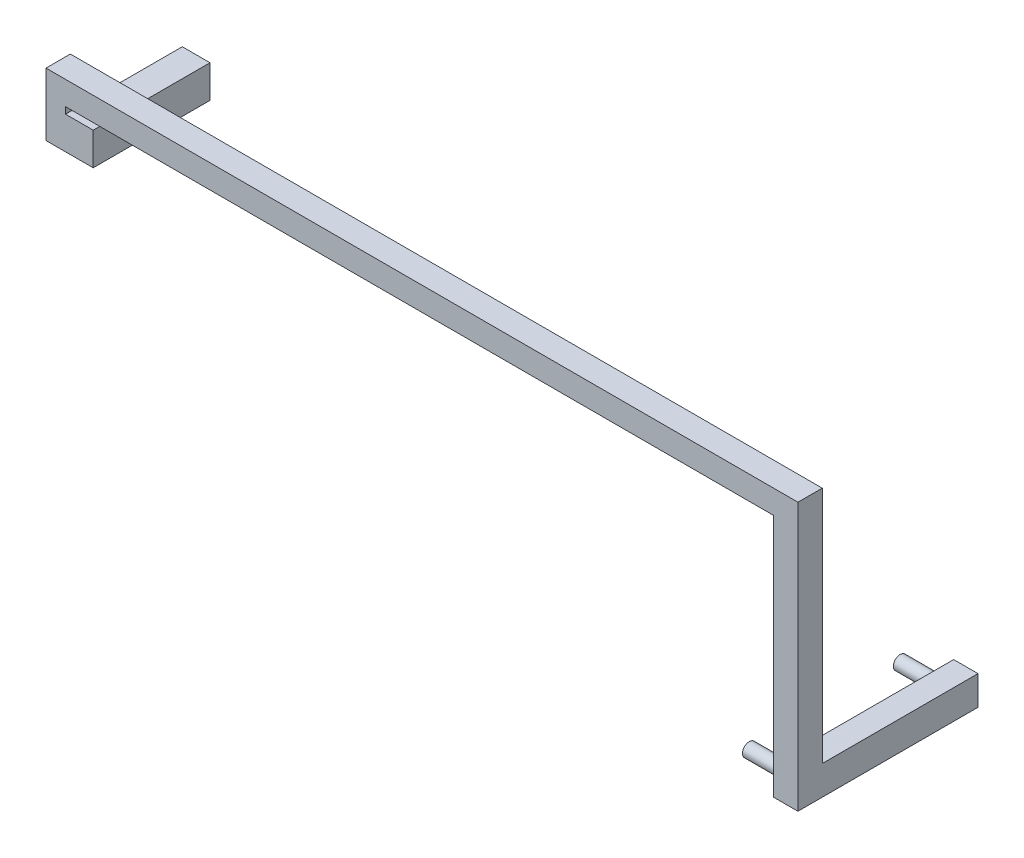
ISO-10303-21;
HEADER;
FILE_DESCRIPTION(('STEP AP214'),'2;1');
FILE_NAME('part.step','',(''),(''),'','','');
FILE_SCHEMA(('AUTOMOTIVE_DESIGN { 1 0 10303 214 1 1 1 1 }'));
ENDSEC;
DATA;
#1=APPLICATION_CONTEXT('core data for automotive mechanical design processes');
#2=APPLICATION_PROTOCOL_DEFINITION('international standard','automotive_design',2000,#1);
#3=PRODUCT_CONTEXT('',#1,'mechanical');
#4=PRODUCT('Part','Part','',(#3));
#5=PRODUCT_RELATED_PRODUCT_CATEGORY('part','',(#4));
#6=PRODUCT_DEFINITION_FORMATION('','',#4);
#7=PRODUCT_DEFINITION_CONTEXT('part definition',#1,'design');
#8=PRODUCT_DEFINITION('design','',#6,#7);
#9=PRODUCT_DEFINITION_SHAPE('','',#8);
#10=(LENGTH_UNIT() NAMED_UNIT(*) SI_UNIT(.MILLI.,.METRE.));
#11=(NAMED_UNIT(*) PLANE_ANGLE_UNIT() SI_UNIT($,.RADIAN.));
#12=(NAMED_UNIT(*) SI_UNIT($,.STERADIAN.) SOLID_ANGLE_UNIT());
#13=UNCERTAINTY_MEASURE_WITH_UNIT(LENGTH_MEASURE(1.E-05),#10,'distance_accuracy_value','');
#14=(GEOMETRIC_REPRESENTATION_CONTEXT(3) GLOBAL_UNCERTAINTY_ASSIGNED_CONTEXT((#13)) GLOBAL_UNIT_ASSIGNED_CONTEXT((#10,
#11,#12)) REPRESENTATION_CONTEXT('',''));
#15=CARTESIAN_POINT('',(0.,0.,0.));
#16=DIRECTION('',(0.,0.,1.));
#17=DIRECTION('',(1.,0.,0.));
#18=AXIS2_PLACEMENT_3D('',#15,#16,#17);
#19=CARTESIAN_POINT('',(0.,0.,0.));
#20=DIRECTION('',(0.,0.,-1.));
#21=DIRECTION('',(-1.,0.,0.));
#22=AXIS2_PLACEMENT_3D('',#19,#20,#21);
#23=PLANE('',#22);
#24=DIRECTION('',(0.,1.,0.));
#25=VECTOR('',#24,1.);
#26=CARTESIAN_POINT('',(150.5,8.05,0.));
#27=LINE('',#26,#25);
#28=CARTESIAN_POINT('',(150.5,-36.1,0.));
#29=VERTEX_POINT('',#28);
#30=CARTESIAN_POINT('',(150.5,12.9,0.));
#31=VERTEX_POINT('',#30);
#32=EDGE_CURVE('E130',#29,#31,#27,.T.);
#33=ORIENTED_EDGE('',*,*,#32,.F.);
#34=DIRECTION('',(1.,0.,0.));
#35=VECTOR('',#34,1.);
#36=CARTESIAN_POINT('',(150.5,-36.1,0.));
#37=LINE('',#36,#35);
#38=CARTESIAN_POINT('',(145.5,-36.1,0.));
#39=VERTEX_POINT('',#38);
#40=EDGE_CURVE('E200',#39,#29,#37,.T.);
#41=ORIENTED_EDGE('',*,*,#40,.F.);
#42=DIRECTION('',(0.,-1.,0.));
#43=VECTOR('',#42,1.);
#44=CARTESIAN_POINT('',(145.5,8.05,0.));
#45=LINE('',#44,#43);
#46=CARTESIAN_POINT('',(145.5,8.05,0.));
#47=VERTEX_POINT('',#46);
#48=EDGE_CURVE('E150',#47,#39,#45,.T.);
#49=ORIENTED_EDGE('',*,*,#48,.F.);
#50=DIRECTION('',(1.,0.,0.));
#51=VECTOR('',#50,1.);
#52=CARTESIAN_POINT('',(5.5,8.05,0.));
#53=LINE('',#52,#51);
#54=CARTESIAN_POINT('',(0.,8.05,0.));
#55=VERTEX_POINT('',#54);
#56=EDGE_CURVE('E148',#55,#47,#53,.T.);
#57=ORIENTED_EDGE('',*,*,#56,.F.);
#58=DIRECTION('',(0.,1.,0.));
#59=VECTOR('',#58,1.);
#60=CARTESIAN_POINT('',(0.,6.7,0.));
#61=LINE('',#60,#59);
#62=CARTESIAN_POINT('',(0.,6.7,0.));
#63=VERTEX_POINT('',#62);
#64=EDGE_CURVE('E144',#63,#55,#61,.T.);
#65=ORIENTED_EDGE('',*,*,#64,.F.);
#66=DIRECTION('',(0.,1.,0.));
#67=VECTOR('',#66,1.);
#68=CARTESIAN_POINT('',(0.,0.,0.));
#69=LINE('',#68,#67);
#70=CARTESIAN_POINT('',(0.,0.,0.));
#71=VERTEX_POINT('',#70);
#72=EDGE_CURVE('E180',#71,#63,#69,.T.);
#73=ORIENTED_EDGE('',*,*,#72,.F.);
#74=DIRECTION('',(1.,0.,0.));
#75=VECTOR('',#74,1.);
#76=CARTESIAN_POINT('',(0.,0.,0.));
#77=LINE('',#76,#75);
#78=CARTESIAN_POINT('',(-4.,0.,0.));
#79=VERTEX_POINT('',#78);
#80=EDGE_CURVE('E85',#79,#71,#77,.T.);
#81=ORIENTED_EDGE('',*,*,#80,.F.);
#82=DIRECTION('',(0.,-1.,0.));
#83=VECTOR('',#82,1.);
#84=CARTESIAN_POINT('',(-4.,0.,0.));
#85=LINE('',#84,#83);
#86=CARTESIAN_POINT('',(-4.,12.9,0.));
#87=VERTEX_POINT('',#86);
#88=EDGE_CURVE('E156',#87,#79,#85,.T.);
#89=ORIENTED_EDGE('',*,*,#88,.F.);
#90=DIRECTION('',(-1.,0.,0.));
#91=VECTOR('',#90,1.);
#92=CARTESIAN_POINT('',(-4.,12.9,0.));
#93=LINE('',#92,#91);
#94=EDGE_CURVE('E154',#31,#87,#93,.T.);
#95=ORIENTED_EDGE('',*,*,#94,.F.);
#96=EDGE_LOOP('',(#33,#41,#49,#57,#65,#73,#81,#89,#95));
#97=FACE_BOUND('',#96,.T.);
#98=ADVANCED_FACE('F33',(#97),#23,.T.);
#99=CARTESIAN_POINT('',(0.,0.,5.));
#100=DIRECTION('',(0.,1.,0.));
#101=DIRECTION('',(0.,0.,1.));
#102=AXIS2_PLACEMENT_3D('',#99,#100,#101);
#103=PLANE('',#102);
#104=ORIENTED_EDGE('',*,*,#80,.T.);
#105=DIRECTION('',(0.,0.,1.));
#106=VECTOR('',#105,1.);
#107=CARTESIAN_POINT('',(0.,0.,-19.));
#108=LINE('',#107,#106);
#109=CARTESIAN_POINT('',(0.,0.,-19.));
#110=VERTEX_POINT('',#109);
#111=EDGE_CURVE('E145',#110,#71,#108,.T.);
#112=ORIENTED_EDGE('',*,*,#111,.F.);
#113=DIRECTION('',(1.,0.,0.));
#114=VECTOR('',#113,1.);
#115=CARTESIAN_POINT('',(5.7,0.,-19.));
#116=LINE('',#115,#114);
#117=CARTESIAN_POINT('',(5.7,0.,-19.));
#118=VERTEX_POINT('',#117);
#119=EDGE_CURVE('E228',#110,#118,#116,.T.);
#120=ORIENTED_EDGE('',*,*,#119,.T.);
#121=DIRECTION('',(0.,0.,-1.));
#122=VECTOR('',#121,1.);
#123=CARTESIAN_POINT('',(5.7,0.,5.));
#124=LINE('',#123,#122);
#125=CARTESIAN_POINT('',(5.7,0.,5.));
#126=VERTEX_POINT('',#125);
#127=EDGE_CURVE('E177',#126,#118,#124,.T.);
#128=ORIENTED_EDGE('',*,*,#127,.F.);
#129=DIRECTION('',(1.,0.,0.));
#130=VECTOR('',#129,1.);
#131=CARTESIAN_POINT('',(0.,0.,5.));
#132=LINE('',#131,#130);
#133=CARTESIAN_POINT('',(-4.,0.,5.));
#134=VERTEX_POINT('',#133);
#135=EDGE_CURVE('E91',#134,#126,#132,.T.);
#136=ORIENTED_EDGE('',*,*,#135,.F.);
#137=DIRECTION('',(0.,0.,-1.));
#138=VECTOR('',#137,1.);
#139=CARTESIAN_POINT('',(-4.,0.,5.));
#140=LINE('',#139,#138);
#141=EDGE_CURVE('E139',#134,#79,#140,.T.);
#142=ORIENTED_EDGE('',*,*,#141,.T.);
#143=EDGE_LOOP('',(#104,#112,#120,#128,#136,#142));
#144=FACE_BOUND('',#143,.T.);
#145=ADVANCED_FACE('F35',(#144),#103,.F.);
#146=CARTESIAN_POINT('',(5.7,0.,5.));
#147=DIRECTION('',(-1.,0.,0.));
#148=DIRECTION('',(0.,0.,1.));
#149=AXIS2_PLACEMENT_3D('',#146,#147,#148);
#150=PLANE('',#149);
#151=ORIENTED_EDGE('',*,*,#127,.T.);
#152=DIRECTION('',(0.,1.,0.));
#153=VECTOR('',#152,1.);
#154=CARTESIAN_POINT('',(5.7,6.7,-19.));
#155=LINE('',#154,#153);
#156=CARTESIAN_POINT('',(5.7,6.7,-19.));
#157=VERTEX_POINT('',#156);
#158=EDGE_CURVE('E219',#118,#157,#155,.T.);
#159=ORIENTED_EDGE('',*,*,#158,.T.);
#160=DIRECTION('',(0.,0.,-1.));
#161=VECTOR('',#160,1.);
#162=CARTESIAN_POINT('',(5.7,6.7,5.));
#163=LINE('',#162,#161);
#164=CARTESIAN_POINT('',(5.7,6.7,5.));
#165=VERTEX_POINT('',#164);
#166=EDGE_CURVE('E174',#165,#157,#163,.T.);
#167=ORIENTED_EDGE('',*,*,#166,.F.);
#168=DIRECTION('',(0.,1.,0.));
#169=VECTOR('',#168,1.);
#170=CARTESIAN_POINT('',(5.7,0.,5.));
#171=LINE('',#170,#169);
#172=EDGE_CURVE('E236',#126,#165,#171,.T.);
#173=ORIENTED_EDGE('',*,*,#172,.F.);
#174=EDGE_LOOP('',(#151,#159,#167,#173));
#175=FACE_BOUND('',#174,.T.);
#176=ADVANCED_FACE('F294',(#175),#150,.F.);
#177=CARTESIAN_POINT('',(0.,6.7,5.));
#178=DIRECTION('',(0.,-1.,0.));
#179=DIRECTION('',(0.,0.,-1.));
#180=AXIS2_PLACEMENT_3D('',#177,#178,#179);
#181=PLANE('',#180);
#182=ORIENTED_EDGE('',*,*,#166,.T.);
#183=DIRECTION('',(-1.,0.,0.));
#184=VECTOR('',#183,1.);
#185=CARTESIAN_POINT('',(5.7,6.7,-19.));
#186=LINE('',#185,#184);
#187=CARTESIAN_POINT('',(0.,6.7,-19.));
#188=VERTEX_POINT('',#187);
#189=EDGE_CURVE('E222',#157,#188,#186,.T.);
#190=ORIENTED_EDGE('',*,*,#189,.T.);
#191=DIRECTION('',(0.,0.,1.));
#192=VECTOR('',#191,1.);
#193=CARTESIAN_POINT('',(0.,6.7,-19.));
#194=LINE('',#193,#192);
#195=EDGE_CURVE('E231',#188,#63,#194,.T.);
#196=ORIENTED_EDGE('',*,*,#195,.T.);
#197=DIRECTION('',(0.,0.,-1.));
#198=VECTOR('',#197,1.);
#199=CARTESIAN_POINT('',(0.,6.7,5.));
#200=LINE('',#199,#198);
#201=CARTESIAN_POINT('',(0.,6.7,5.));
#202=VERTEX_POINT('',#201);
#203=EDGE_CURVE('E171',#202,#63,#200,.T.);
#204=ORIENTED_EDGE('',*,*,#203,.F.);
#205=DIRECTION('',(-1.,0.,0.));
#206=VECTOR('',#205,1.);
#207=CARTESIAN_POINT('',(0.,6.7,5.));
#208=LINE('',#207,#206);
#209=EDGE_CURVE('E238',#165,#202,#208,.T.);
#210=ORIENTED_EDGE('',*,*,#209,.F.);
#211=EDGE_LOOP('',(#182,#190,#196,#204,#210));
#212=FACE_BOUND('',#211,.T.);
#213=ADVANCED_FACE('F377',(#212),#181,.F.);
#214=CARTESIAN_POINT('',(0.,6.7,5.));
#215=DIRECTION('',(-1.,0.,0.));
#216=DIRECTION('',(0.,0.,1.));
#217=AXIS2_PLACEMENT_3D('',#214,#215,#216);
#218=PLANE('',#217);
#219=ORIENTED_EDGE('',*,*,#64,.T.);
#220=DIRECTION('',(0.,0.,-1.));
#221=VECTOR('',#220,1.);
#222=CARTESIAN_POINT('',(0.,8.05,5.));
#223=LINE('',#222,#221);
#224=CARTESIAN_POINT('',(0.,8.05,5.));
#225=VERTEX_POINT('',#224);
#226=EDGE_CURVE('E168',#225,#55,#223,.T.);
#227=ORIENTED_EDGE('',*,*,#226,.F.);
#228=DIRECTION('',(0.,1.,0.));
#229=VECTOR('',#228,1.);
#230=CARTESIAN_POINT('',(0.,6.7,5.));
#231=LINE('',#230,#229);
#232=EDGE_CURVE('E240',#202,#225,#231,.T.);
#233=ORIENTED_EDGE('',*,*,#232,.F.);
#234=ORIENTED_EDGE('',*,*,#203,.T.);
#235=EDGE_LOOP('',(#219,#227,#233,#234));
#236=FACE_BOUND('',#235,.T.);
#237=ADVANCED_FACE('F372',(#236),#218,.F.);
#238=CARTESIAN_POINT('',(5.5,8.05,5.));
#239=DIRECTION('',(0.,1.,0.));
#240=DIRECTION('',(0.,0.,1.));
#241=AXIS2_PLACEMENT_3D('',#238,#239,#240);
#242=PLANE('',#241);
#243=ORIENTED_EDGE('',*,*,#56,.T.);
#244=DIRECTION('',(0.,0.,-1.));
#245=VECTOR('',#244,1.);
#246=CARTESIAN_POINT('',(145.5,8.05,5.));
#247=LINE('',#246,#245);
#248=CARTESIAN_POINT('',(145.5,8.05,5.));
#249=VERTEX_POINT('',#248);
#250=EDGE_CURVE('E165',#249,#47,#247,.T.);
#251=ORIENTED_EDGE('',*,*,#250,.F.);
#252=DIRECTION('',(1.,0.,0.));
#253=VECTOR('',#252,1.);
#254=CARTESIAN_POINT('',(0.,8.05,5.));
#255=LINE('',#254,#253);
#256=EDGE_CURVE('E242',#225,#249,#255,.T.);
#257=ORIENTED_EDGE('',*,*,#256,.F.);
#258=ORIENTED_EDGE('',*,*,#226,.T.);
#259=EDGE_LOOP('',(#243,#251,#257,#258));
#260=FACE_BOUND('',#259,.T.);
#261=ADVANCED_FACE('F191',(#260),#242,.F.);
#262=CARTESIAN_POINT('',(145.5,8.05,5.));
#263=DIRECTION('',(1.,0.,0.));
#264=DIRECTION('',(0.,0.,-1.));
#265=AXIS2_PLACEMENT_3D('',#262,#263,#264);
#266=PLANE('',#265);
#267=CARTESIAN_POINT('',(145.5,-39.1,2.));
#268=DIRECTION('',(1.,0.,0.));
#269=DIRECTION('',(0.,0.,-1.));
#270=AXIS2_PLACEMENT_3D('',#267,#268,#269);
#271=CIRCLE('',#270,1.4);
#272=CARTESIAN_POINT('',(145.5,-39.1,0.6));
#273=VERTEX_POINT('',#272);
#274=EDGE_CURVE('E11',#273,#273,#271,.F.);
#275=ORIENTED_EDGE('',*,*,#274,.F.);
#276=EDGE_LOOP('',(#275));
#277=FACE_BOUND('',#276,.T.);
#278=CARTESIAN_POINT('',(145.5,-39.1,-29.));
#279=DIRECTION('',(1.,0.,0.));
#280=DIRECTION('',(0.,0.,-1.));
#281=AXIS2_PLACEMENT_3D('',#278,#279,#280);
#282=CIRCLE('',#281,1.4);
#283=CARTESIAN_POINT('',(145.5,-39.1,-30.4));
#284=VERTEX_POINT('',#283);
#285=EDGE_CURVE('E41',#284,#284,#282,.F.);
#286=ORIENTED_EDGE('',*,*,#285,.F.);
#287=EDGE_LOOP('',(#286));
#288=FACE_BOUND('',#287,.T.);
#289=ORIENTED_EDGE('',*,*,#48,.T.);
#290=DIRECTION('',(0.,0.,1.));
#291=VECTOR('',#290,1.);
#292=CARTESIAN_POINT('',(145.5,-36.1,-32.));
#293=LINE('',#292,#291);
#294=CARTESIAN_POINT('',(145.5,-36.1,-32.));
#295=VERTEX_POINT('',#294);
#296=EDGE_CURVE('E48',#295,#39,#293,.T.);
#297=ORIENTED_EDGE('',*,*,#296,.F.);
#298=DIRECTION('',(0.,1.,0.));
#299=VECTOR('',#298,1.);
#300=CARTESIAN_POINT('',(145.5,-42.1,-32.));
#301=LINE('',#300,#299);
#302=CARTESIAN_POINT('',(145.5,-42.1,-32.));
#303=VERTEX_POINT('',#302);
#304=EDGE_CURVE('E249',#303,#295,#301,.T.);
#305=ORIENTED_EDGE('',*,*,#304,.F.);
#306=DIRECTION('',(0.,0.,-1.));
#307=VECTOR('',#306,1.);
#308=CARTESIAN_POINT('',(145.5,-42.1,5.));
#309=LINE('',#308,#307);
#310=CARTESIAN_POINT('',(145.5,-42.1,5.));
#311=VERTEX_POINT('',#310);
#312=EDGE_CURVE('E162',#311,#303,#309,.T.);
#313=ORIENTED_EDGE('',*,*,#312,.F.);
#314=DIRECTION('',(0.,-1.,0.));
#315=VECTOR('',#314,1.);
#316=CARTESIAN_POINT('',(145.5,8.05,5.));
#317=LINE('',#316,#315);
#318=EDGE_CURVE('E244',#249,#311,#317,.T.);
#319=ORIENTED_EDGE('',*,*,#318,.F.);
#320=ORIENTED_EDGE('',*,*,#250,.T.);
#321=EDGE_LOOP('',(#289,#297,#305,#313,#319,#320));
#322=FACE_BOUND('',#321,.T.);
#323=ADVANCED_FACE('F187',(#277,#288,#322),#266,.F.);
#324=CARTESIAN_POINT('',(145.5,-42.1,5.));
#325=DIRECTION('',(0.,1.,0.));
#326=DIRECTION('',(0.,0.,1.));
#327=AXIS2_PLACEMENT_3D('',#324,#325,#326);
#328=PLANE('',#327);
#329=ORIENTED_EDGE('',*,*,#312,.T.);
#330=DIRECTION('',(-1.,0.,0.));
#331=VECTOR('',#330,1.);
#332=CARTESIAN_POINT('',(150.5,-42.1,-32.));
#333=LINE('',#332,#331);
#334=CARTESIAN_POINT('',(150.5,-42.1,-32.));
#335=VERTEX_POINT('',#334);
#336=EDGE_CURVE('E207',#335,#303,#333,.T.);
#337=ORIENTED_EDGE('',*,*,#336,.F.);
#338=DIRECTION('',(0.,0.,-1.));
#339=VECTOR('',#338,1.);
#340=CARTESIAN_POINT('',(150.5,-42.1,5.));
#341=LINE('',#340,#339);
#342=CARTESIAN_POINT('',(150.5,-42.1,5.));
#343=VERTEX_POINT('',#342);
#344=EDGE_CURVE('E133',#343,#335,#341,.T.);
#345=ORIENTED_EDGE('',*,*,#344,.F.);
#346=DIRECTION('',(1.,0.,0.));
#347=VECTOR('',#346,1.);
#348=CARTESIAN_POINT('',(145.5,-42.1,5.));
#349=LINE('',#348,#347);
#350=EDGE_CURVE('E120',#311,#343,#349,.T.);
#351=ORIENTED_EDGE('',*,*,#350,.F.);
#352=EDGE_LOOP('',(#329,#337,#345,#351));
#353=FACE_BOUND('',#352,.T.);
#354=ADVANCED_FACE('F190',(#353),#328,.F.);
#355=CARTESIAN_POINT('',(150.5,8.05,5.));
#356=DIRECTION('',(-1.,0.,0.));
#357=DIRECTION('',(0.,0.,1.));
#358=AXIS2_PLACEMENT_3D('',#355,#356,#357);
#359=PLANE('',#358);
#360=ORIENTED_EDGE('',*,*,#344,.T.);
#361=DIRECTION('',(0.,-1.,0.));
#362=VECTOR('',#361,1.);
#363=CARTESIAN_POINT('',(150.5,-42.1,-32.));
#364=LINE('',#363,#362);
#365=CARTESIAN_POINT('',(150.5,-36.1,-32.));
#366=VERTEX_POINT('',#365);
#367=EDGE_CURVE('E203',#366,#335,#364,.T.);
#368=ORIENTED_EDGE('',*,*,#367,.F.);
#369=DIRECTION('',(0.,0.,1.));
#370=VECTOR('',#369,1.);
#371=CARTESIAN_POINT('',(150.5,-36.1,-32.));
#372=LINE('',#371,#370);
#373=EDGE_CURVE('E216',#366,#29,#372,.T.);
#374=ORIENTED_EDGE('',*,*,#373,.T.);
#375=ORIENTED_EDGE('',*,*,#32,.T.);
#376=DIRECTION('',(0.,0.,-1.));
#377=VECTOR('',#376,1.);
#378=CARTESIAN_POINT('',(150.5,12.9,5.));
#379=LINE('',#378,#377);
#380=CARTESIAN_POINT('',(150.5,12.9,5.));
#381=VERTEX_POINT('',#380);
#382=EDGE_CURVE('E126',#381,#31,#379,.T.);
#383=ORIENTED_EDGE('',*,*,#382,.F.);
#384=DIRECTION('',(0.,1.,0.));
#385=VECTOR('',#384,1.);
#386=CARTESIAN_POINT('',(150.5,8.05,5.));
#387=LINE('',#386,#385);
#388=EDGE_CURVE('E113',#343,#381,#387,.T.);
#389=ORIENTED_EDGE('',*,*,#388,.F.);
#390=EDGE_LOOP('',(#360,#368,#374,#375,#383,#389));
#391=FACE_BOUND('',#390,.T.);
#392=ADVANCED_FACE('F127',(#391),#359,.F.);
#393=CARTESIAN_POINT('',(-4.,12.9,5.));
#394=DIRECTION('',(0.,-1.,0.));
#395=DIRECTION('',(0.,0.,-1.));
#396=AXIS2_PLACEMENT_3D('',#393,#394,#395);
#397=PLANE('',#396);
#398=ORIENTED_EDGE('',*,*,#94,.T.);
#399=DIRECTION('',(0.,0.,-1.));
#400=VECTOR('',#399,1.);
#401=CARTESIAN_POINT('',(-4.,12.9,5.));
#402=LINE('',#401,#400);
#403=CARTESIAN_POINT('',(-4.,12.9,5.));
#404=VERTEX_POINT('',#403);
#405=EDGE_CURVE('E134',#404,#87,#402,.T.);
#406=ORIENTED_EDGE('',*,*,#405,.F.);
#407=DIRECTION('',(-1.,0.,0.));
#408=VECTOR('',#407,1.);
#409=CARTESIAN_POINT('',(5.5,12.9,5.));
#410=LINE('',#409,#408);
#411=EDGE_CURVE('E117',#381,#404,#410,.T.);
#412=ORIENTED_EDGE('',*,*,#411,.F.);
#413=ORIENTED_EDGE('',*,*,#382,.T.);
#414=EDGE_LOOP('',(#398,#406,#412,#413));
#415=FACE_BOUND('',#414,.T.);
#416=ADVANCED_FACE('F136',(#415),#397,.F.);
#417=CARTESIAN_POINT('',(-4.,0.,5.));
#418=DIRECTION('',(1.,0.,0.));
#419=DIRECTION('',(0.,0.,-1.));
#420=AXIS2_PLACEMENT_3D('',#417,#418,#419);
#421=PLANE('',#420);
#422=ORIENTED_EDGE('',*,*,#88,.T.);
#423=ORIENTED_EDGE('',*,*,#141,.F.);
#424=DIRECTION('',(0.,-1.,0.));
#425=VECTOR('',#424,1.);
#426=CARTESIAN_POINT('',(-4.,0.,5.));
#427=LINE('',#426,#425);
#428=EDGE_CURVE('E57',#404,#134,#427,.T.);
#429=ORIENTED_EDGE('',*,*,#428,.F.);
#430=ORIENTED_EDGE('',*,*,#405,.T.);
#431=EDGE_LOOP('',(#422,#423,#429,#430));
#432=FACE_BOUND('',#431,.T.);
#433=ADVANCED_FACE('F280',(#432),#421,.F.);
#434=CARTESIAN_POINT('',(0.,0.,5.));
#435=DIRECTION('',(0.,0.,-1.));
#436=DIRECTION('',(-1.,0.,0.));
#437=AXIS2_PLACEMENT_3D('',#434,#435,#436);
#438=PLANE('',#437);
#439=ORIENTED_EDGE('',*,*,#135,.T.);
#440=ORIENTED_EDGE('',*,*,#172,.T.);
#441=ORIENTED_EDGE('',*,*,#209,.T.);
#442=ORIENTED_EDGE('',*,*,#232,.T.);
#443=ORIENTED_EDGE('',*,*,#256,.T.);
#444=ORIENTED_EDGE('',*,*,#318,.T.);
#445=ORIENTED_EDGE('',*,*,#350,.T.);
#446=ORIENTED_EDGE('',*,*,#388,.T.);
#447=ORIENTED_EDGE('',*,*,#411,.T.);
#448=ORIENTED_EDGE('',*,*,#428,.T.);
#449=EDGE_LOOP('',(#439,#440,#441,#442,#443,#444,#445,#446,#447,#448));
#450=FACE_BOUND('',#449,.T.);
#451=ADVANCED_FACE('F115',(#450),#438,.F.);
#452=CARTESIAN_POINT('',(0.,6.7,-19.));
#453=DIRECTION('',(-1.,0.,0.));
#454=DIRECTION('',(0.,-1.,0.));
#455=AXIS2_PLACEMENT_3D('',#452,#453,#454);
#456=PLANE('',#455);
#457=ORIENTED_EDGE('',*,*,#111,.T.);
#458=ORIENTED_EDGE('',*,*,#72,.T.);
#459=ORIENTED_EDGE('',*,*,#195,.F.);
#460=DIRECTION('',(0.,-1.,0.));
#461=VECTOR('',#460,1.);
#462=CARTESIAN_POINT('',(0.,6.7,-19.));
#463=LINE('',#462,#461);
#464=EDGE_CURVE('E225',#188,#110,#463,.T.);
#465=ORIENTED_EDGE('',*,*,#464,.T.);
#466=EDGE_LOOP('',(#457,#458,#459,#465));
#467=FACE_BOUND('',#466,.T.);
#468=ADVANCED_FACE('F275',(#467),#456,.T.);
#469=CARTESIAN_POINT('',(0.,0.,-19.));
#470=DIRECTION('',(0.,0.,-1.));
#471=DIRECTION('',(-1.,0.,0.));
#472=AXIS2_PLACEMENT_3D('',#469,#470,#471);
#473=PLANE('',#472);
#474=ORIENTED_EDGE('',*,*,#158,.F.);
#475=ORIENTED_EDGE('',*,*,#119,.F.);
#476=ORIENTED_EDGE('',*,*,#464,.F.);
#477=ORIENTED_EDGE('',*,*,#189,.F.);
#478=EDGE_LOOP('',(#474,#475,#476,#477));
#479=FACE_BOUND('',#478,.T.);
#480=ADVANCED_FACE('F298',(#479),#473,.T.);
#481=CARTESIAN_POINT('',(150.5,-36.1,-32.));
#482=DIRECTION('',(0.,-1.,0.));
#483=DIRECTION('',(0.,0.,-1.));
#484=AXIS2_PLACEMENT_3D('',#481,#482,#483);
#485=PLANE('',#484);
#486=ORIENTED_EDGE('',*,*,#40,.T.);
#487=ORIENTED_EDGE('',*,*,#373,.F.);
#488=DIRECTION('',(1.,0.,0.));
#489=VECTOR('',#488,1.);
#490=CARTESIAN_POINT('',(150.5,-36.1,-32.));
#491=LINE('',#490,#489);
#492=EDGE_CURVE('E214',#295,#366,#491,.T.);
#493=ORIENTED_EDGE('',*,*,#492,.F.);
#494=ORIENTED_EDGE('',*,*,#296,.T.);
#495=EDGE_LOOP('',(#486,#487,#493,#494));
#496=FACE_BOUND('',#495,.T.);
#497=ADVANCED_FACE('F301',(#496),#485,.F.);
#498=CARTESIAN_POINT('',(0.,0.,-32.));
#499=DIRECTION('',(0.,0.,1.));
#500=DIRECTION('',(1.,0.,0.));
#501=AXIS2_PLACEMENT_3D('',#498,#499,#500);
#502=PLANE('',#501);
#503=ORIENTED_EDGE('',*,*,#367,.T.);
#504=ORIENTED_EDGE('',*,*,#336,.T.);
#505=ORIENTED_EDGE('',*,*,#304,.T.);
#506=ORIENTED_EDGE('',*,*,#492,.T.);
#507=EDGE_LOOP('',(#503,#504,#505,#506));
#508=FACE_BOUND('',#507,.T.);
#509=ADVANCED_FACE('F305',(#508),#502,.F.);
#510=CARTESIAN_POINT('',(137.5,-39.1,-29.));
#511=DIRECTION('',(1.,0.,0.));
#512=DIRECTION('',(0.,0.,-1.));
#513=AXIS2_PLACEMENT_3D('',#510,#511,#512);
#514=CYLINDRICAL_SURFACE('',#513,1.4);
#515=CARTESIAN_POINT('',(137.5,-39.1,-29.));
#516=DIRECTION('',(-1.,0.,0.));
#517=DIRECTION('',(0.,0.,1.));
#518=AXIS2_PLACEMENT_3D('',#515,#516,#517);
#519=CIRCLE('',#518,1.4);
#520=CARTESIAN_POINT('',(137.5,-39.1,-27.6));
#521=VERTEX_POINT('',#520);
#522=EDGE_CURVE('E204',#521,#521,#519,.T.);
#523=ORIENTED_EDGE('',*,*,#522,.F.);
#524=EDGE_LOOP('',(#523));
#525=FACE_BOUND('',#524,.T.);
#526=ORIENTED_EDGE('',*,*,#285,.T.);
#527=EDGE_LOOP('',(#526));
#528=FACE_BOUND('',#527,.T.);
#529=ADVANCED_FACE('F185',(#525,#528),#514,.T.);
#530=CARTESIAN_POINT('',(137.5,-39.1,-29.));
#531=DIRECTION('',(-1.,0.,0.));
#532=DIRECTION('',(0.,0.,1.));
#533=AXIS2_PLACEMENT_3D('',#530,#531,#532);
#534=PLANE('',#533);
#535=ORIENTED_EDGE('',*,*,#522,.T.);
#536=EDGE_LOOP('',(#535));
#537=FACE_BOUND('',#536,.T.);
#538=ADVANCED_FACE('F311',(#537),#534,.T.);
#539=CARTESIAN_POINT('',(137.5,-39.1,2.));
#540=DIRECTION('',(1.,0.,0.));
#541=DIRECTION('',(0.,0.,-1.));
#542=AXIS2_PLACEMENT_3D('',#539,#540,#541);
#543=CYLINDRICAL_SURFACE('',#542,1.4);
#544=CARTESIAN_POINT('',(137.5,-39.1,2.));
#545=DIRECTION('',(-1.,0.,0.));
#546=DIRECTION('',(0.,0.,1.));
#547=AXIS2_PLACEMENT_3D('',#544,#545,#546);
#548=CIRCLE('',#547,1.4);
#549=CARTESIAN_POINT('',(137.5,-39.1,3.4));
#550=VERTEX_POINT('',#549);
#551=EDGE_CURVE('E210',#550,#550,#548,.T.);
#552=ORIENTED_EDGE('',*,*,#551,.F.);
#553=EDGE_LOOP('',(#552));
#554=FACE_BOUND('',#553,.T.);
#555=ORIENTED_EDGE('',*,*,#274,.T.);
#556=EDGE_LOOP('',(#555));
#557=FACE_BOUND('',#556,.T.);
#558=ADVANCED_FACE('F315',(#554,#557),#543,.T.);
#559=CARTESIAN_POINT('',(137.5,-39.1,2.));
#560=DIRECTION('',(-1.,0.,0.));
#561=DIRECTION('',(0.,0.,1.));
#562=AXIS2_PLACEMENT_3D('',#559,#560,#561);
#563=PLANE('',#562);
#564=ORIENTED_EDGE('',*,*,#551,.T.);
#565=EDGE_LOOP('',(#564));
#566=FACE_BOUND('',#565,.T.);
#567=ADVANCED_FACE('F319',(#566),#563,.T.);
#568=CLOSED_SHELL('',(#98,#145,#176,#213,#237,#261,#323,#354,#392,#416,#433,#451,#468,#480,#497,
#509,#529,#538,#558,#567));
#569=MANIFOLD_SOLID_BREP('B2',#568);
#570=ADVANCED_BREP_SHAPE_REPRESENTATION('',(#18,#569),#14);
#571=SHAPE_DEFINITION_REPRESENTATION(#9,#570);
ENDSEC;
END-ISO-10303-21;
